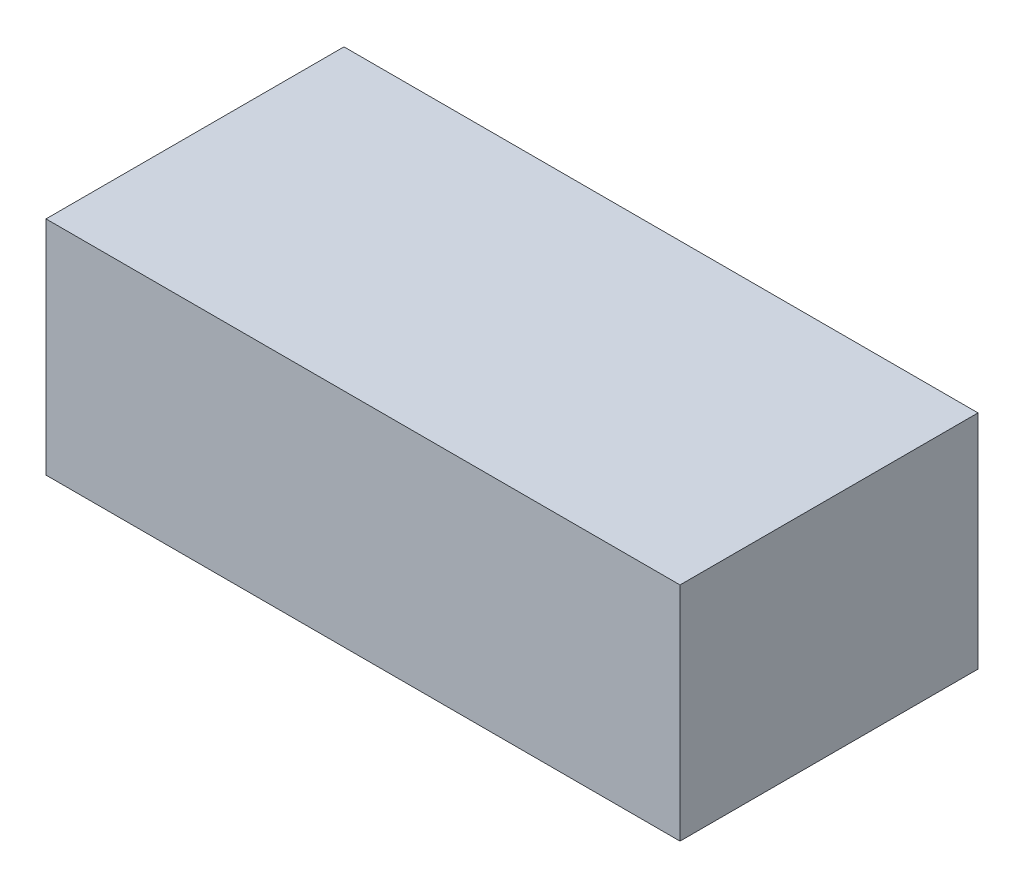
ISO-10303-21;
HEADER;
FILE_DESCRIPTION(('STEP AP214'),'2;1');
FILE_NAME('part.step','',(''),(''),'','','');
FILE_SCHEMA(('AUTOMOTIVE_DESIGN { 1 0 10303 214 1 1 1 1 }'));
ENDSEC;
DATA;
#1=APPLICATION_CONTEXT('core data for automotive mechanical design processes');
#2=APPLICATION_PROTOCOL_DEFINITION('international standard','automotive_design',2000,#1);
#3=PRODUCT_CONTEXT('',#1,'mechanical');
#4=PRODUCT('Part','Part','',(#3));
#5=PRODUCT_RELATED_PRODUCT_CATEGORY('part','',(#4));
#6=PRODUCT_DEFINITION_FORMATION('','',#4);
#7=PRODUCT_DEFINITION_CONTEXT('part definition',#1,'design');
#8=PRODUCT_DEFINITION('design','',#6,#7);
#9=PRODUCT_DEFINITION_SHAPE('','',#8);
#10=(LENGTH_UNIT() NAMED_UNIT(*) SI_UNIT(.MILLI.,.METRE.));
#11=(NAMED_UNIT(*) PLANE_ANGLE_UNIT() SI_UNIT($,.RADIAN.));
#12=(NAMED_UNIT(*) SI_UNIT($,.STERADIAN.) SOLID_ANGLE_UNIT());
#13=UNCERTAINTY_MEASURE_WITH_UNIT(LENGTH_MEASURE(1.E-05),#10,'distance_accuracy_value','');
#14=(GEOMETRIC_REPRESENTATION_CONTEXT(3) GLOBAL_UNCERTAINTY_ASSIGNED_CONTEXT((#13)) GLOBAL_UNIT_ASSIGNED_CONTEXT((#10,
#11,#12)) REPRESENTATION_CONTEXT('',''));
#15=CARTESIAN_POINT('',(0.,0.,0.));
#16=DIRECTION('',(0.,0.,1.));
#17=DIRECTION('',(1.,0.,0.));
#18=AXIS2_PLACEMENT_3D('',#15,#16,#17);
#19=CARTESIAN_POINT('',(-35.0000000000002,25.3703703703705,47.));
#20=DIRECTION('',(1.,0.,0.));
#21=DIRECTION('',(0.,1.,0.));
#22=AXIS2_PLACEMENT_3D('',#19,#20,#21);
#23=PLANE('',#22);
#24=DIRECTION('',(0.,-1.,0.));
#25=VECTOR('',#24,1.);
#26=CARTESIAN_POINT('',(-35.0000000000002,25.3703703703705,0.));
#27=LINE('',#26,#25);
#28=CARTESIAN_POINT('',(-35.0000000000002,25.3703703703705,0.));
#29=VERTEX_POINT('',#28);
#30=CARTESIAN_POINT('',(-35.0000000000002,-9.62962962962949,0.));
#31=VERTEX_POINT('',#30);
#32=EDGE_CURVE('E102',#29,#31,#27,.T.);
#33=ORIENTED_EDGE('',*,*,#32,.T.);
#34=DIRECTION('',(0.,0.,-1.));
#35=VECTOR('',#34,1.);
#36=CARTESIAN_POINT('',(-35.0000000000002,-9.62962962962949,47.));
#37=LINE('',#36,#35);
#38=CARTESIAN_POINT('',(-35.0000000000002,-9.62962962962949,47.));
#39=VERTEX_POINT('',#38);
#40=EDGE_CURVE('E11',#39,#31,#37,.T.);
#41=ORIENTED_EDGE('',*,*,#40,.F.);
#42=DIRECTION('',(0.,-1.,0.));
#43=VECTOR('',#42,1.);
#44=CARTESIAN_POINT('',(-35.0000000000002,25.3703703703705,47.));
#45=LINE('',#44,#43);
#46=CARTESIAN_POINT('',(-35.0000000000002,25.3703703703705,47.));
#47=VERTEX_POINT('',#46);
#48=EDGE_CURVE('E90',#47,#39,#45,.T.);
#49=ORIENTED_EDGE('',*,*,#48,.F.);
#50=DIRECTION('',(0.,0.,-1.));
#51=VECTOR('',#50,1.);
#52=CARTESIAN_POINT('',(-35.0000000000002,25.3703703703705,47.));
#53=LINE('',#52,#51);
#54=EDGE_CURVE('E98',#47,#29,#53,.T.);
#55=ORIENTED_EDGE('',*,*,#54,.T.);
#56=EDGE_LOOP('',(#33,#41,#49,#55));
#57=FACE_BOUND('',#56,.T.);
#58=ADVANCED_FACE('F39',(#57),#23,.F.);
#59=CARTESIAN_POINT('',(-35.0000000000002,-9.62962962962949,47.));
#60=DIRECTION('',(0.,1.,0.));
#61=DIRECTION('',(0.,0.,1.));
#62=AXIS2_PLACEMENT_3D('',#59,#60,#61);
#63=PLANE('',#62);
#64=DIRECTION('',(1.,0.,0.));
#65=VECTOR('',#64,1.);
#66=CARTESIAN_POINT('',(-35.0000000000002,-9.62962962962949,0.));
#67=LINE('',#66,#65);
#68=CARTESIAN_POINT('',(64.9999999999998,-9.62962962962949,0.));
#69=VERTEX_POINT('',#68);
#70=EDGE_CURVE('E94',#31,#69,#67,.T.);
#71=ORIENTED_EDGE('',*,*,#70,.T.);
#72=DIRECTION('',(0.,0.,-1.));
#73=VECTOR('',#72,1.);
#74=CARTESIAN_POINT('',(64.9999999999998,-9.62962962962949,47.));
#75=LINE('',#74,#73);
#76=CARTESIAN_POINT('',(64.9999999999998,-9.62962962962949,47.));
#77=VERTEX_POINT('',#76);
#78=EDGE_CURVE('E47',#77,#69,#75,.T.);
#79=ORIENTED_EDGE('',*,*,#78,.F.);
#80=DIRECTION('',(1.,0.,0.));
#81=VECTOR('',#80,1.);
#82=CARTESIAN_POINT('',(-35.0000000000002,-9.62962962962949,47.));
#83=LINE('',#82,#81);
#84=EDGE_CURVE('E85',#39,#77,#83,.T.);
#85=ORIENTED_EDGE('',*,*,#84,.F.);
#86=ORIENTED_EDGE('',*,*,#40,.T.);
#87=EDGE_LOOP('',(#71,#79,#85,#86));
#88=FACE_BOUND('',#87,.T.);
#89=ADVANCED_FACE('F93',(#88),#63,.F.);
#90=CARTESIAN_POINT('',(64.9999999999998,25.3703703703705,47.));
#91=DIRECTION('',(-1.,0.,0.));
#92=DIRECTION('',(0.,0.,1.));
#93=AXIS2_PLACEMENT_3D('',#90,#91,#92);
#94=PLANE('',#93);
#95=DIRECTION('',(0.,1.,0.));
#96=VECTOR('',#95,1.);
#97=CARTESIAN_POINT('',(64.9999999999998,25.3703703703705,0.));
#98=LINE('',#97,#96);
#99=CARTESIAN_POINT('',(64.9999999999998,25.3703703703705,0.));
#100=VERTEX_POINT('',#99);
#101=EDGE_CURVE('E72',#69,#100,#98,.T.);
#102=ORIENTED_EDGE('',*,*,#101,.T.);
#103=DIRECTION('',(0.,0.,-1.));
#104=VECTOR('',#103,1.);
#105=CARTESIAN_POINT('',(64.9999999999998,25.3703703703705,47.));
#106=LINE('',#105,#104);
#107=CARTESIAN_POINT('',(64.9999999999998,25.3703703703705,47.));
#108=VERTEX_POINT('',#107);
#109=EDGE_CURVE('E95',#108,#100,#106,.T.);
#110=ORIENTED_EDGE('',*,*,#109,.F.);
#111=DIRECTION('',(0.,1.,0.));
#112=VECTOR('',#111,1.);
#113=CARTESIAN_POINT('',(64.9999999999998,25.3703703703705,47.));
#114=LINE('',#113,#112);
#115=EDGE_CURVE('E88',#77,#108,#114,.T.);
#116=ORIENTED_EDGE('',*,*,#115,.F.);
#117=ORIENTED_EDGE('',*,*,#78,.T.);
#118=EDGE_LOOP('',(#102,#110,#116,#117));
#119=FACE_BOUND('',#118,.T.);
#120=ADVANCED_FACE('F96',(#119),#94,.F.);
#121=CARTESIAN_POINT('',(-35.0000000000002,25.3703703703705,47.));
#122=DIRECTION('',(0.,-1.,0.));
#123=DIRECTION('',(0.,0.,-1.));
#124=AXIS2_PLACEMENT_3D('',#121,#122,#123);
#125=PLANE('',#124);
#126=DIRECTION('',(-1.,0.,0.));
#127=VECTOR('',#126,1.);
#128=CARTESIAN_POINT('',(-35.0000000000002,25.3703703703705,0.));
#129=LINE('',#128,#127);
#130=EDGE_CURVE('E78',#100,#29,#129,.T.);
#131=ORIENTED_EDGE('',*,*,#130,.T.);
#132=ORIENTED_EDGE('',*,*,#54,.F.);
#133=DIRECTION('',(-1.,0.,0.));
#134=VECTOR('',#133,1.);
#135=CARTESIAN_POINT('',(-35.0000000000002,25.3703703703705,47.));
#136=LINE('',#135,#134);
#137=EDGE_CURVE('E55',#108,#47,#136,.T.);
#138=ORIENTED_EDGE('',*,*,#137,.F.);
#139=ORIENTED_EDGE('',*,*,#109,.T.);
#140=EDGE_LOOP('',(#131,#132,#138,#139));
#141=FACE_BOUND('',#140,.T.);
#142=ADVANCED_FACE('F109',(#141),#125,.F.);
#143=CARTESIAN_POINT('',(0.,0.,47.));
#144=DIRECTION('',(0.,0.,1.));
#145=DIRECTION('',(1.,0.,0.));
#146=AXIS2_PLACEMENT_3D('',#143,#144,#145);
#147=PLANE('',#146);
#148=ORIENTED_EDGE('',*,*,#48,.T.);
#149=ORIENTED_EDGE('',*,*,#84,.T.);
#150=ORIENTED_EDGE('',*,*,#115,.T.);
#151=ORIENTED_EDGE('',*,*,#137,.T.);
#152=EDGE_LOOP('',(#148,#149,#150,#151));
#153=FACE_BOUND('',#152,.T.);
#154=ADVANCED_FACE('F86',(#153),#147,.T.);
#155=CARTESIAN_POINT('',(0.,0.,0.));
#156=DIRECTION('',(0.,0.,1.));
#157=DIRECTION('',(1.,0.,0.));
#158=AXIS2_PLACEMENT_3D('',#155,#156,#157);
#159=PLANE('',#158);
#160=ORIENTED_EDGE('',*,*,#32,.F.);
#161=ORIENTED_EDGE('',*,*,#130,.F.);
#162=ORIENTED_EDGE('',*,*,#101,.F.);
#163=ORIENTED_EDGE('',*,*,#70,.F.);
#164=EDGE_LOOP('',(#160,#161,#162,#163));
#165=FACE_BOUND('',#164,.T.);
#166=ADVANCED_FACE('F112',(#165),#159,.F.);
#167=CLOSED_SHELL('',(#58,#89,#120,#142,#154,#166));
#168=MANIFOLD_SOLID_BREP('B2',#167);
#169=ADVANCED_BREP_SHAPE_REPRESENTATION('',(#18,#168),#14);
#170=SHAPE_DEFINITION_REPRESENTATION(#9,#169);
ENDSEC;
END-ISO-10303-21;
